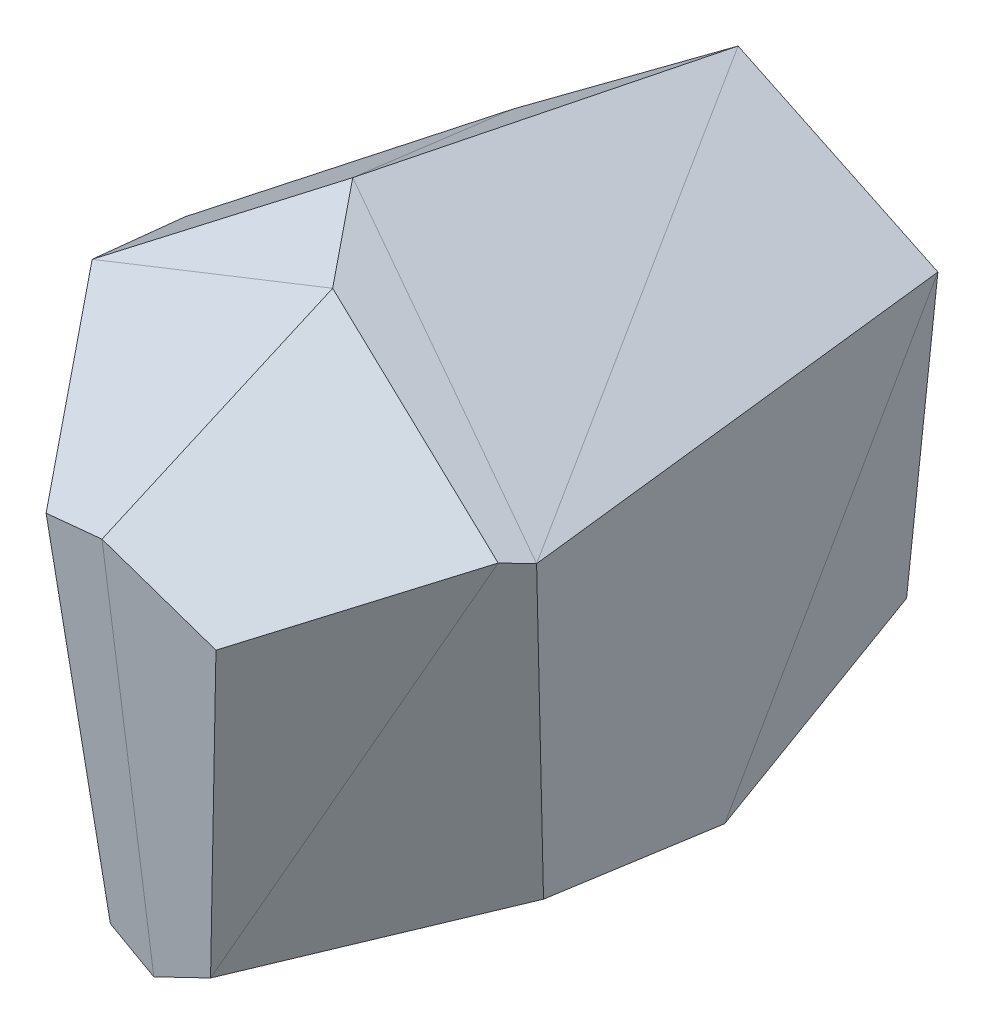
ISO-10303-21;
HEADER;
FILE_DESCRIPTION(('STEP AP214'),'2;1');
FILE_NAME('part.step','',(''),(''),'','','');
FILE_SCHEMA(('AUTOMOTIVE_DESIGN { 1 0 10303 214 1 1 1 1 }'));
ENDSEC;
DATA;
#1=APPLICATION_CONTEXT('core data for automotive mechanical design processes');
#2=APPLICATION_PROTOCOL_DEFINITION('international standard','automotive_design',2000,#1);
#3=PRODUCT_CONTEXT('',#1,'mechanical');
#4=PRODUCT('Part','Part','',(#3));
#5=PRODUCT_RELATED_PRODUCT_CATEGORY('part','',(#4));
#6=PRODUCT_DEFINITION_FORMATION('','',#4);
#7=PRODUCT_DEFINITION_CONTEXT('part definition',#1,'design');
#8=PRODUCT_DEFINITION('design','',#6,#7);
#9=PRODUCT_DEFINITION_SHAPE('','',#8);
#10=(LENGTH_UNIT() NAMED_UNIT(*) SI_UNIT(.MILLI.,.METRE.));
#11=(NAMED_UNIT(*) PLANE_ANGLE_UNIT() SI_UNIT($,.RADIAN.));
#12=(NAMED_UNIT(*) SI_UNIT($,.STERADIAN.) SOLID_ANGLE_UNIT());
#13=UNCERTAINTY_MEASURE_WITH_UNIT(LENGTH_MEASURE(1.E-05),#10,'distance_accuracy_value','');
#14=(GEOMETRIC_REPRESENTATION_CONTEXT(3) GLOBAL_UNCERTAINTY_ASSIGNED_CONTEXT((#13)) GLOBAL_UNIT_ASSIGNED_CONTEXT((#10,
#11,#12)) REPRESENTATION_CONTEXT('',''));
#15=CARTESIAN_POINT('',(0.,0.,0.));
#16=DIRECTION('',(0.,0.,1.));
#17=DIRECTION('',(1.,0.,0.));
#18=AXIS2_PLACEMENT_3D('',#15,#16,#17);
#19=CARTESIAN_POINT('',(-0.213634701442467,16.5817104423319,0.));
#20=DIRECTION('',(-0.432224087228075,-0.901090652237481,0.0348994967025046));
#21=DIRECTION('',(0.901639906907274,-0.432487546956259,0.));
#22=AXIS2_PLACEMENT_3D('',#19,#20,#21);
#23=PLANE('',#22);
#24=DIRECTION('',(-0.901639906907274,0.432487546956259,0.));
#25=VECTOR('',#24,1.);
#26=CARTESIAN_POINT('',(13.3109639021667,10.094397237988,0.));
#27=LINE('',#26,#25);
#28=CARTESIAN_POINT('',(13.3109639021667,10.094397237988,0.));
#29=VERTEX_POINT('',#28);
#30=CARTESIAN_POINT('',(-0.213634701442467,16.5817104423319,0.));
#31=VERTEX_POINT('',#30);
#32=EDGE_CURVE('E3167',#29,#31,#27,.T.);
#33=ORIENTED_EDGE('',*,*,#32,.T.);
#34=DIRECTION('',(-0.473036413338795,0.193611366423096,-0.859506364401888));
#35=VECTOR('',#34,1.);
#36=CARTESIAN_POINT('',(8.13335031301446,13.1653324879255,15.1664576789242));
#37=LINE('',#36,#35);
#38=CARTESIAN_POINT('',(16.4803353274714,9.74895453351913,30.3329153578483));
#39=VERTEX_POINT('',#38);
#40=EDGE_CURVE('E3169',#39,#31,#37,.T.);
#41=ORIENTED_EDGE('',*,*,#40,.F.);
#42=DIRECTION('',(0.103913817223106,-0.0113259903104543,0.994521815011421));
#43=VECTOR('',#42,1.);
#44=CARTESIAN_POINT('',(14.895649614819,9.92167588575355,15.1664576789242));
#45=LINE('',#44,#43);
#46=EDGE_CURVE('E3163',#29,#39,#45,.T.);
#47=ORIENTED_EDGE('',*,*,#46,.F.);
#48=EDGE_LOOP('',(#33,#41,#47));
#49=FACE_BOUND('',#48,.T.);
#50=ADVANCED_FACE('F3082',(#49),#23,.F.);
#51=CARTESIAN_POINT('',(13.3109639021667,10.094397237988,0.));
#52=DIRECTION('',(-0.989073800366903,0.103955845408877,0.104528463267657));
#53=DIRECTION('',(-0.0477677402216508,-0.896784421095503,0.439881739873936));
#54=AXIS2_PLACEMENT_3D('',#51,#52,#53);
#55=PLANE('',#54);
#56=DIRECTION('',(0.0477677402216509,0.896784421095502,-0.439881739873936));
#57=VECTOR('',#56,1.);
#58=CARTESIAN_POINT('',(12.6041939772684,-3.17439578019947,6.50847586283599));
#59=LINE('',#58,#57);
#60=CARTESIAN_POINT('',(11.8974240523701,-16.4431887983869,13.016951725672));
#61=VERTEX_POINT('',#60);
#62=EDGE_CURVE('E3172',#61,#29,#59,.T.);
#63=ORIENTED_EDGE('',*,*,#62,.T.);
#64=ORIENTED_EDGE('',*,*,#46,.T.);
#65=DIRECTION('',(0.117967495608886,0.983342151006367,0.138281900601414));
#66=VECTOR('',#65,1.);
#67=CARTESIAN_POINT('',(15.1237091279692,-1.55948020305408,28.7426735009321));
#68=LINE('',#67,#66);
#69=CARTESIAN_POINT('',(13.767082928467,-12.8679149396273,27.1524316440158));
#70=VERTEX_POINT('',#69);
#71=EDGE_CURVE('E3182',#70,#39,#68,.T.);
#72=ORIENTED_EDGE('',*,*,#71,.F.);
#73=DIRECTION('',(0.127187678646051,0.243215908759157,0.961597273356724));
#74=VECTOR('',#73,1.);
#75=CARTESIAN_POINT('',(12.8322534904185,-14.6555518690071,20.0846916848439));
#76=LINE('',#75,#74);
#77=EDGE_CURVE('E3177',#61,#70,#76,.T.);
#78=ORIENTED_EDGE('',*,*,#77,.F.);
#79=EDGE_LOOP('',(#63,#64,#72,#78));
#80=FACE_BOUND('',#79,.T.);
#81=ADVANCED_FACE('F3175',(#80),#55,.F.);
#82=CARTESIAN_POINT('',(11.1890360978333,-10.094397237988,0.));
#83=DIRECTION('',(0.989073800366903,-0.103955845408877,-0.104528463267657));
#84=DIRECTION('',(0.10452846326765,0.994521895368274,0.));
#85=AXIS2_PLACEMENT_3D('',#82,#83,#84);
#86=PLANE('',#85);
#87=DIRECTION('',(0.10452846326765,0.994521895368274,0.));
#88=VECTOR('',#87,1.);
#89=CARTESIAN_POINT('',(11.1890360978333,-10.094397237988,0.));
#90=LINE('',#89,#88);
#91=CARTESIAN_POINT('',(11.1890360978333,-10.094397237988,0.));
#92=VERTEX_POINT('',#91);
#93=EDGE_CURVE('E3185',#92,#29,#90,.T.);
#94=ORIENTED_EDGE('',*,*,#93,.T.);
#95=ORIENTED_EDGE('',*,*,#62,.F.);
#96=DIRECTION('',(0.0488543416921865,-0.437847693820615,0.897720808667033));
#97=VECTOR('',#96,1.);
#98=CARTESIAN_POINT('',(11.5432300751017,-13.2687930181874,6.50847586283599));
#99=LINE('',#98,#97);
#100=EDGE_CURVE('E3187',#92,#61,#99,.T.);
#101=ORIENTED_EDGE('',*,*,#100,.F.);
#102=EDGE_LOOP('',(#94,#95,#101));
#103=FACE_BOUND('',#102,.T.);
#104=ADVANCED_FACE('F3186',(#103),#86,.T.);
#105=CARTESIAN_POINT('',(13.767082928467,-12.8679149396273,27.1524316440158));
#106=DIRECTION('',(-0.864501868451229,0.170216240328803,-0.472930175578447));
#107=DIRECTION('',(-0.491686209419427,-0.0911190336224293,0.865991912882834));
#108=AXIS2_PLACEMENT_3D('',#105,#106,#107);
#109=PLANE('',#108);
#110=DIRECTION('',(0.491686209419428,0.091119033622429,-0.865991912882834));
#111=VECTOR('',#110,1.);
#112=CARTESIAN_POINT('',(9.68608739028576,-13.6242029186935,34.3401645209433));
#113=LINE('',#112,#111);
#114=CARTESIAN_POINT('',(5.60509185210451,-14.3804908977596,41.5278973978709));
#115=VERTEX_POINT('',#114);
#116=EDGE_CURVE('E3306',#115,#70,#113,.T.);
#117=ORIENTED_EDGE('',*,*,#116,.T.);
#118=ORIENTED_EDGE('',*,*,#71,.T.);
#119=DIRECTION('',(0.429218309342306,-0.239609962743223,-0.870837934795863));
#120=VECTOR('',#119,1.);
#121=CARTESIAN_POINT('',(16.0511170181291,9.98856449626235,31.2037532926442));
#122=LINE('',#121,#120);
#123=CARTESIAN_POINT('',(15.6218987087868,10.2281744590056,32.0745912274401));
#124=VERTEX_POINT('',#123);
#125=EDGE_CURVE('E3249',#124,#39,#122,.T.);
#126=ORIENTED_EDGE('',*,*,#125,.F.);
#127=DIRECTION('',(-0.355195235882614,-0.872621467221505,0.335213542910309));
#128=VECTOR('',#127,1.);
#129=CARTESIAN_POINT('',(10.6134952804456,-2.07615821937703,36.8012443126555));
#130=LINE('',#129,#128);
#131=EDGE_CURVE('E3208',#124,#115,#130,.T.);
#132=ORIENTED_EDGE('',*,*,#131,.T.);
#133=EDGE_LOOP('',(#117,#118,#126,#132));
#134=FACE_BOUND('',#133,.T.);
#135=ADVANCED_FACE('F3352',(#134),#109,.F.);
#136=CARTESIAN_POINT('',(-3.20887226160522,18.9127171818239,23.0901485386871));
#137=DIRECTION('',(-0.432224087228075,-0.901090652237481,0.0348994967025047));
#138=DIRECTION('',(0.12800160513516,-0.099615672627865,-0.986758484559277));
#139=AXIS2_PLACEMENT_3D('',#136,#137,#138);
#140=PLANE('',#139);
#141=DIRECTION('',(-0.12800160513516,0.0996156726278648,0.986758484559277));
#142=VECTOR('',#141,1.);
#143=CARTESIAN_POINT('',(-1.71125348152384,17.7472138120779,11.5450742693435));
#144=LINE('',#143,#142);
#145=CARTESIAN_POINT('',(-3.20887226160522,18.9127171818239,23.0901485386871));
#146=VERTEX_POINT('',#145);
#147=EDGE_CURVE('E3225',#31,#146,#144,.T.);
#148=ORIENTED_EDGE('',*,*,#147,.T.);
#149=DIRECTION('',(-0.860047334854681,0.400283739569481,-0.31637242238481));
#150=VECTOR('',#149,1.);
#151=CARTESIAN_POINT('',(6.63573153293308,14.3308358576715,26.7115319482677));
#152=LINE('',#151,#150);
#153=EDGE_CURVE('E3192',#39,#146,#152,.T.);
#154=ORIENTED_EDGE('',*,*,#153,.F.);
#155=ORIENTED_EDGE('',*,*,#40,.T.);
#156=EDGE_LOOP('',(#148,#154,#155));
#157=FACE_BOUND('',#156,.T.);
#158=ADVANCED_FACE('F3830',(#157),#140,.F.);
#159=CARTESIAN_POINT('',(0.,0.,0.));
#160=DIRECTION('',(0.,0.,-1.));
#161=DIRECTION('',(-1.,0.,0.));
#162=AXIS2_PLACEMENT_3D('',#159,#160,#161);
#163=PLANE('',#162);
#164=DIRECTION('',(1.,0.,0.));
#165=VECTOR('',#164,1.);
#166=CARTESIAN_POINT('',(-1.06096390216665,-10.094397237988,0.));
#167=LINE('',#166,#165);
#168=CARTESIAN_POINT('',(-13.3109639021667,-10.094397237988,0.));
#169=VERTEX_POINT('',#168);
#170=EDGE_CURVE('E3226',#169,#92,#167,.T.);
#171=ORIENTED_EDGE('',*,*,#170,.F.);
#172=DIRECTION('',(-0.139173100960063,0.990268068741571,0.));
#173=VECTOR('',#172,1.);
#174=CARTESIAN_POINT('',(-14.3895554346071,-2.41981970524081,0.));
#175=LINE('',#174,#173);
#176=CARTESIAN_POINT('',(-15.4681469670476,5.25475782750636,0.));
#177=VERTEX_POINT('',#176);
#178=EDGE_CURVE('E3222',#169,#177,#175,.T.);
#179=ORIENTED_EDGE('',*,*,#178,.T.);
#180=DIRECTION('',(0.802869066610797,0.596155400780289,0.));
#181=VECTOR('',#180,1.);
#182=CARTESIAN_POINT('',(-7.84089083424504,10.9182341349191,0.));
#183=LINE('',#182,#181);
#184=EDGE_CURVE('E3197',#177,#31,#183,.T.);
#185=ORIENTED_EDGE('',*,*,#184,.T.);
#186=ORIENTED_EDGE('',*,*,#32,.F.);
#187=ORIENTED_EDGE('',*,*,#93,.F.);
#188=EDGE_LOOP('',(#171,#179,#185,#186,#187));
#189=FACE_BOUND('',#188,.T.);
#190=ADVANCED_FACE('F3195',(#189),#163,.T.);
#191=CARTESIAN_POINT('',(15.6218987087868,10.2281744590056,32.0745912274401));
#192=DIRECTION('',(0.432224087228076,0.90109065223748,-0.0348994967025096));
#193=DIRECTION('',(0.429218309342308,-0.239609962743219,-0.870837934795863));
#194=AXIS2_PLACEMENT_3D('',#191,#192,#193);
#195=PLANE('',#194);
#196=ORIENTED_EDGE('',*,*,#125,.T.);
#197=ORIENTED_EDGE('',*,*,#153,.T.);
#198=DIRECTION('',(-0.580840253199202,0.248589271252592,-0.775130940216936));
#199=VECTOR('',#198,1.);
#200=CARTESIAN_POINT('',(-1.17593137540801,18.0426547324398,25.8031068294463));
#201=LINE('',#200,#199);
#202=CARTESIAN_POINT('',(0.857009510789199,17.1725922830557,28.5160651202056));
#203=VERTEX_POINT('',#202);
#204=EDGE_CURVE('E3231',#203,#146,#201,.T.);
#205=ORIENTED_EDGE('',*,*,#204,.F.);
#206=DIRECTION('',(0.884125101676501,-0.415833402637735,0.21308539564278));
#207=VECTOR('',#206,1.);
#208=CARTESIAN_POINT('',(8.23945410978799,13.7003833710307,30.2953281738228));
#209=LINE('',#208,#207);
#210=EDGE_CURVE('E3349',#203,#124,#209,.T.);
#211=ORIENTED_EDGE('',*,*,#210,.T.);
#212=EDGE_LOOP('',(#196,#197,#205,#211));
#213=FACE_BOUND('',#212,.T.);
#214=ADVANCED_FACE('F3346',(#213),#195,.T.);
#215=CARTESIAN_POINT('',(1.97169476707473,-20.1234156987358,20.5625350773406));
#216=DIRECTION('',(-0.449393337278926,0.878387524436952,-0.162729792364002));
#217=DIRECTION('',(0.164860179230892,0.260576972414976,0.951273232436929));
#218=AXIS2_PLACEMENT_3D('',#215,#216,#217);
#219=PLANE('',#218);
#220=DIRECTION('',(-0.164860179230891,-0.260576972414976,-0.951273232436929));
#221=VECTOR('',#220,1.);
#222=CARTESIAN_POINT('',(3.78839330958962,-17.2519532982477,31.0452162376058));
#223=LINE('',#222,#221);
#224=CARTESIAN_POINT('',(1.97169476707473,-20.1234156987358,20.5625350773406));
#225=VERTEX_POINT('',#224);
#226=EDGE_CURVE('E3255',#115,#225,#223,.T.);
#227=ORIENTED_EDGE('',*,*,#226,.T.);
#228=DIRECTION('',(-0.76351763733041,-0.283094376949913,0.580429488589897));
#229=VECTOR('',#228,1.);
#230=CARTESIAN_POINT('',(6.93455940972239,-18.2833022485613,16.7897434015063));
#231=LINE('',#230,#229);
#232=EDGE_CURVE('E3288',#61,#225,#231,.T.);
#233=ORIENTED_EDGE('',*,*,#232,.F.);
#234=ORIENTED_EDGE('',*,*,#77,.T.);
#235=ORIENTED_EDGE('',*,*,#116,.F.);
#236=EDGE_LOOP('',(#227,#233,#234,#235));
#237=FACE_BOUND('',#236,.T.);
#238=ADVANCED_FACE('F3356',(#237),#219,.F.);
#239=CARTESIAN_POINT('',(11.1890360978334,-10.094397237988,0.));
#240=DIRECTION('',(0.,0.898794046299165,0.438371146789082));
#241=DIRECTION('',(-0.983994627583345,-0.0781169178062516,0.16016341667049));
#242=AXIS2_PLACEMENT_3D('',#239,#240,#241);
#243=PLANE('',#242);
#244=DIRECTION('',(0.983994627583345,0.0781169178062516,-0.16016341667049));
#245=VECTOR('',#244,1.);
#246=CARTESIAN_POINT('',(-1.87100302877826,-11.1312016822415,2.12576413501935));
#247=LINE('',#246,#245);
#248=CARTESIAN_POINT('',(-14.9310421553899,-12.1680061264949,4.2515282700387));
#249=VERTEX_POINT('',#248);
#250=EDGE_CURVE('E3273',#249,#92,#247,.T.);
#251=ORIENTED_EDGE('',*,*,#250,.T.);
#252=ORIENTED_EDGE('',*,*,#100,.T.);
#253=ORIENTED_EDGE('',*,*,#232,.T.);
#254=DIRECTION('',(0.681561972680024,-0.32078264404197,0.657701887391208));
#255=VECTOR('',#254,1.);
#256=CARTESIAN_POINT('',(-6.47967369415757,-16.1457109126153,12.4070316736897));
#257=LINE('',#256,#255);
#258=EDGE_CURVE('E3291',#249,#225,#257,.T.);
#259=ORIENTED_EDGE('',*,*,#258,.F.);
#260=EDGE_LOOP('',(#251,#252,#253,#259));
#261=FACE_BOUND('',#260,.T.);
#262=ADVANCED_FACE('F3359',(#261),#243,.F.);
#263=CARTESIAN_POINT('',(15.6218987087868,10.2281744590056,32.0745912274401));
#264=DIRECTION('',(-0.86450186845123,0.170216240328803,-0.472930175578446));
#265=DIRECTION('',(-0.355195235882613,-0.872621467221506,0.335213542910309));
#266=AXIS2_PLACEMENT_3D('',#263,#264,#265);
#267=PLANE('',#266);
#268=ORIENTED_EDGE('',*,*,#131,.F.);
#269=DIRECTION('',(0.499528708255858,0.186603774485215,-0.845961051689795));
#270=VECTOR('',#269,1.);
#271=CARTESIAN_POINT('',(12.0752448801702,8.90328766016055,38.0809146944376));
#272=LINE('',#271,#270);
#273=CARTESIAN_POINT('',(8.52859105155357,7.57840086131553,44.0872381614351));
#274=VERTEX_POINT('',#273);
#275=EDGE_CURVE('E3283',#274,#124,#272,.T.);
#276=ORIENTED_EDGE('',*,*,#275,.F.);
#277=DIRECTION('',(-0.131098618809375,-0.98470366632624,-0.114768644106022));
#278=VECTOR('',#277,1.);
#279=CARTESIAN_POINT('',(7.06684145182904,-3.40104501822205,42.807567779653));
#280=LINE('',#279,#278);
#281=EDGE_CURVE('E3426',#274,#115,#280,.T.);
#282=ORIENTED_EDGE('',*,*,#281,.T.);
#283=EDGE_LOOP('',(#268,#276,#282));
#284=FACE_BOUND('',#283,.T.);
#285=ADVANCED_FACE('F3657',(#284),#267,.F.);
#286=CARTESIAN_POINT('',(0.907767731711992,10.3215097196951,44.1789208688472));
#287=DIRECTION('',(0.317423333243214,0.869183399924076,0.379160447316424));
#288=DIRECTION('',(0.940842385165627,-0.338655414614758,-0.0113188527669255));
#289=AXIS2_PLACEMENT_3D('',#286,#287,#288);
#290=PLANE('',#289);
#291=DIRECTION('',(-0.940842385165628,0.338655414614756,0.0113188527669264));
#292=VECTOR('',#291,1.);
#293=CARTESIAN_POINT('',(4.71817939163278,8.94995529050529,44.1330795151412));
#294=LINE('',#293,#292);
#295=CARTESIAN_POINT('',(0.907767731711992,10.3215097196951,44.1789208688472));
#296=VERTEX_POINT('',#295);
#297=EDGE_CURVE('E3294',#274,#296,#294,.T.);
#298=ORIENTED_EDGE('',*,*,#297,.F.);
#299=ORIENTED_EDGE('',*,*,#275,.T.);
#300=ORIENTED_EDGE('',*,*,#210,.F.);
#301=DIRECTION('',(-0.00296905345881379,0.40074750476988,-0.916183727285239));
#302=VECTOR('',#301,1.);
#303=CARTESIAN_POINT('',(0.882388621250595,13.7470510013754,36.3474929945264));
#304=LINE('',#303,#302);
#305=EDGE_CURVE('E3268',#296,#203,#304,.T.);
#306=ORIENTED_EDGE('',*,*,#305,.F.);
#307=EDGE_LOOP('',(#298,#299,#300,#306));
#308=FACE_BOUND('',#307,.T.);
#309=ADVANCED_FACE('F3654',(#308),#290,.T.);
#310=CARTESIAN_POINT('',(-13.3109639021667,-10.094397237988,0.));
#311=DIRECTION('',(0.,-0.898794046299165,-0.438371146789082));
#312=DIRECTION('',(1.,0.,0.));
#313=AXIS2_PLACEMENT_3D('',#310,#311,#312);
#314=PLANE('',#313);
#315=ORIENTED_EDGE('',*,*,#170,.T.);
#316=ORIENTED_EDGE('',*,*,#250,.F.);
#317=DIRECTION('',(0.324015650644643,0.414721777701388,-0.850305654007739));
#318=VECTOR('',#317,1.);
#319=CARTESIAN_POINT('',(-14.1210030287783,-11.1312016822414,2.12576413501935));
#320=LINE('',#319,#318);
#321=EDGE_CURVE('E3263',#249,#169,#320,.T.);
#322=ORIENTED_EDGE('',*,*,#321,.T.);
#323=EDGE_LOOP('',(#315,#316,#322));
#324=FACE_BOUND('',#323,.T.);
#325=ADVANCED_FACE('F3770',(#324),#314,.T.);
#326=CARTESIAN_POINT('',(-13.3109639021667,-10.094397237988,0.));
#327=DIRECTION('',(-0.904654896047371,-0.1271409542081,-0.406736643075804));
#328=DIRECTION('',(-0.396459101793276,0.601103697505697,0.693898065604919));
#329=AXIS2_PLACEMENT_3D('',#326,#327,#328);
#330=PLANE('',#329);
#331=DIRECTION('',(0.396459101793276,-0.601103697505697,-0.693898065604919));
#332=VECTOR('',#331,1.);
#333=CARTESIAN_POINT('',(-17.740409280741,-3.37855698380491,7.75258675104907));
#334=LINE('',#333,#332);
#335=CARTESIAN_POINT('',(-22.1698546593153,3.33728327037816,15.5051735020981));
#336=VERTEX_POINT('',#335);
#337=EDGE_CURVE('E3219',#336,#169,#334,.T.);
#338=ORIENTED_EDGE('',*,*,#337,.F.);
#339=DIRECTION('',(-0.394218099545157,-0.112792621007541,0.912069029535185));
#340=VECTOR('',#339,1.);
#341=CARTESIAN_POINT('',(-18.8190008131815,4.29602054894227,7.75258675104907));
#342=LINE('',#341,#340);
#343=EDGE_CURVE('E3214',#177,#336,#342,.T.);
#344=ORIENTED_EDGE('',*,*,#343,.F.);
#345=ORIENTED_EDGE('',*,*,#178,.F.);
#346=EDGE_LOOP('',(#338,#344,#345));
#347=FACE_BOUND('',#346,.T.);
#348=ADVANCED_FACE('F3760',(#347),#330,.T.);
#349=CARTESIAN_POINT('',(-15.4681469670476,5.25475782750636,0.));
#350=DIRECTION('',(-0.588815738533512,0.792984416115985,-0.156434465040235));
#351=DIRECTION('',(0.415632009467005,0.463052279033567,0.782836266142696));
#352=AXIS2_PLACEMENT_3D('',#349,#350,#351);
#353=PLANE('',#352);
#354=DIRECTION('',(-0.415632009467005,-0.463052279033568,-0.782836266142696));
#355=VECTOR('',#354,1.);
#356=CARTESIAN_POINT('',(-9.33850961432641,12.0837375046651,11.5450742693435));
#357=LINE('',#356,#355);
#358=EDGE_CURVE('E3218',#146,#177,#357,.T.);
#359=ORIENTED_EDGE('',*,*,#358,.F.);
#360=ORIENTED_EDGE('',*,*,#147,.F.);
#361=ORIENTED_EDGE('',*,*,#184,.F.);
#362=EDGE_LOOP('',(#359,#360,#361));
#363=FACE_BOUND('',#362,.T.);
#364=ADVANCED_FACE('F3750',(#363),#353,.T.);
#365=CARTESIAN_POINT('',(0.857009510789199,17.1725922830557,28.5160651202056));
#366=DIRECTION('',(0.141832227832622,-0.90675691703383,-0.397083760130453));
#367=DIRECTION('',(-0.945458123816266,-0.242922362669883,0.217019957203726));
#368=AXIS2_PLACEMENT_3D('',#365,#366,#367);
#369=PLANE('',#368);
#370=DIRECTION('',(0.945458123816267,0.242922362669884,-0.217019957203725));
#371=VECTOR('',#370,1.);
#372=CARTESIAN_POINT('',(-5.76277459005345,15.4717304959146,30.0355668581186));
#373=LINE('',#372,#371);
#374=CARTESIAN_POINT('',(-12.3825586908961,13.7708687087735,31.5550685960316));
#375=VERTEX_POINT('',#374);
#376=EDGE_CURVE('E3422',#375,#203,#373,.T.);
#377=ORIENTED_EDGE('',*,*,#376,.T.);
#378=ORIENTED_EDGE('',*,*,#204,.T.);
#379=DIRECTION('',(-0.67953232809562,-0.380877664670399,0.627031115358855));
#380=VECTOR('',#379,1.);
#381=CARTESIAN_POINT('',(-7.79571547625065,16.3417929452987,27.3226085673593));
#382=LINE('',#381,#380);
#383=EDGE_CURVE('E3237',#146,#375,#382,.T.);
#384=ORIENTED_EDGE('',*,*,#383,.T.);
#385=EDGE_LOOP('',(#377,#378,#384));
#386=FACE_BOUND('',#385,.T.);
#387=ADVANCED_FACE('F3741',(#386),#369,.F.);
#388=CARTESIAN_POINT('',(5.60509185210451,-14.3804908977596,41.5278973978709));
#389=DIRECTION('',(-0.449393337278928,0.878387524436952,-0.162729792364002));
#390=DIRECTION('',(-0.164860179230892,-0.260576972414976,-0.951273232436929));
#391=AXIS2_PLACEMENT_3D('',#388,#389,#390);
#392=PLANE('',#391);
#393=ORIENTED_EDGE('',*,*,#226,.F.);
#394=DIRECTION('',(-0.881659182496142,-0.465453400050153,-0.077654480244135));
#395=VECTOR('',#394,1.);
#396=CARTESIAN_POINT('',(3.49936018472321,-15.4921675905617,41.3424294739718));
#397=LINE('',#396,#395);
#398=CARTESIAN_POINT('',(1.39362851734191,-16.6038442833638,41.1569615500727));
#399=VERTEX_POINT('',#398);
#400=EDGE_CURVE('E3365',#115,#399,#397,.T.);
#401=ORIENTED_EDGE('',*,*,#400,.T.);
#402=DIRECTION('',(-0.0276573443507364,0.168392461325914,0.985331949280072));
#403=VECTOR('',#402,1.);
#404=CARTESIAN_POINT('',(1.68266164220832,-18.3636299910498,30.8597483137067));
#405=LINE('',#404,#403);
#406=EDGE_CURVE('E3260',#225,#399,#405,.T.);
#407=ORIENTED_EDGE('',*,*,#406,.F.);
#408=EDGE_LOOP('',(#393,#401,#407));
#409=FACE_BOUND('',#408,.T.);
#410=ADVANCED_FACE('F3362',(#409),#392,.F.);
#411=CARTESIAN_POINT('',(-20.72319051607,-6.86057278264977,15.475260655859));
#412=DIRECTION('',(0.521782412326185,0.843198813198828,-0.129456075976198));
#413=DIRECTION('',(0.847649906448324,-0.495364810916608,0.190008789806421));
#414=AXIS2_PLACEMENT_3D('',#411,#412,#413);
#415=PLANE('',#414);
#416=DIRECTION('',(-0.847649906448324,0.495364810916608,-0.190008789806422));
#417=VECTOR('',#416,1.);
#418=CARTESIAN_POINT('',(-9.37574787449766,-13.4919942406928,18.0188978665998));
#419=LINE('',#418,#417);
#420=CARTESIAN_POINT('',(-20.72319051607,-6.86057278264977,15.475260655859));
#421=VERTEX_POINT('',#420);
#422=EDGE_CURVE('E3101',#225,#421,#419,.T.);
#423=ORIENTED_EDGE('',*,*,#422,.T.);
#424=DIRECTION('',(0.422784551874466,-0.387403893711325,-0.819250539110968));
#425=VECTOR('',#424,1.);
#426=CARTESIAN_POINT('',(-17.82711633573,-9.51428945457234,9.86339446294883));
#427=LINE('',#426,#425);
#428=EDGE_CURVE('E3267',#421,#249,#427,.T.);
#429=ORIENTED_EDGE('',*,*,#428,.T.);
#430=ORIENTED_EDGE('',*,*,#258,.T.);
#431=EDGE_LOOP('',(#423,#429,#430));
#432=FACE_BOUND('',#431,.T.);
#433=ADVANCED_FACE('F3368',(#432),#415,.F.);
#434=CARTESIAN_POINT('',(8.52859105155358,7.57840086131553,44.0872381614351));
#435=DIRECTION('',(0.0283625009500825,0.111994972845945,-0.993303928612533));
#436=DIRECTION('',(-0.131098618809375,-0.98470366632624,-0.114768644106022));
#437=AXIS2_PLACEMENT_3D('',#434,#435,#436);
#438=PLANE('',#437);
#439=ORIENTED_EDGE('',*,*,#281,.F.);
#440=ORIENTED_EDGE('',*,*,#297,.T.);
#441=DIRECTION('',(-0.0179292602917713,0.993600831034429,0.111516501886864));
#442=VECTOR('',#441,1.);
#443=CARTESIAN_POINT('',(1.15069812452695,-3.14116728183437,42.66794120946));
#444=LINE('',#443,#442);
#445=EDGE_CURVE('E3410',#399,#296,#444,.T.);
#446=ORIENTED_EDGE('',*,*,#445,.F.);
#447=ORIENTED_EDGE('',*,*,#400,.F.);
#448=EDGE_LOOP('',(#439,#440,#446,#447));
#449=FACE_BOUND('',#448,.T.);
#450=ADVANCED_FACE('F3659',(#449),#438,.F.);
#451=CARTESIAN_POINT('',(-3.05137636973384,9.77854664288249,44.0046535993877));
#452=DIRECTION('',(-0.141832227832622,0.906756917033831,0.397083760130451));
#453=DIRECTION('',(0.989786025361458,0.135740769203145,0.0435668173648894));
#454=AXIS2_PLACEMENT_3D('',#451,#452,#453);
#455=PLANE('',#454);
#456=DIRECTION('',(-0.989786025361458,-0.135740769203148,-0.0435668173648876));
#457=VECTOR('',#456,1.);
#458=CARTESIAN_POINT('',(-1.07180431901092,10.0500281812888,44.0917872341175));
#459=LINE('',#458,#457);
#460=CARTESIAN_POINT('',(-3.05137636973384,9.77854664288249,44.0046535993877));
#461=VERTEX_POINT('',#460);
#462=EDGE_CURVE('E3414',#296,#461,#459,.T.);
#463=ORIENTED_EDGE('',*,*,#462,.F.);
#464=ORIENTED_EDGE('',*,*,#305,.T.);
#465=ORIENTED_EDGE('',*,*,#376,.F.);
#466=DIRECTION('',(0.580932048501189,-0.248550264713474,0.775074655072061));
#467=VECTOR('',#466,1.);
#468=CARTESIAN_POINT('',(-7.71696753031497,11.774707675828,37.7798610977097));
#469=LINE('',#468,#467);
#470=EDGE_CURVE('E3392',#375,#461,#469,.T.);
#471=ORIENTED_EDGE('',*,*,#470,.T.);
#472=EDGE_LOOP('',(#463,#464,#465,#471));
#473=FACE_BOUND('',#472,.T.);
#474=ADVANCED_FACE('F3707',(#473),#455,.T.);
#475=CARTESIAN_POINT('',(-20.72319051607,-6.86057278264977,15.475260655859));
#476=DIRECTION('',(-0.904654896047371,-0.127140954208099,-0.406736643075805));
#477=DIRECTION('',(-0.140452829441285,0.990083111944459,0.00290415982904705));
#478=AXIS2_PLACEMENT_3D('',#475,#476,#477);
#479=PLANE('',#478);
#480=DIRECTION('',(0.140452829441285,-0.990083111944459,-0.00290415982904469));
#481=VECTOR('',#480,1.);
#482=CARTESIAN_POINT('',(-21.4465225876927,-1.7616447561358,15.4902170789786));
#483=LINE('',#482,#481);
#484=EDGE_CURVE('E3386',#336,#421,#483,.T.);
#485=ORIENTED_EDGE('',*,*,#484,.F.);
#486=ORIENTED_EDGE('',*,*,#337,.T.);
#487=ORIENTED_EDGE('',*,*,#321,.F.);
#488=ORIENTED_EDGE('',*,*,#428,.F.);
#489=EDGE_LOOP('',(#485,#486,#487,#488));
#490=FACE_BOUND('',#489,.T.);
#491=ADVANCED_FACE('F3697',(#490),#479,.T.);
#492=CARTESIAN_POINT('',(-3.20887226160522,18.9127171818239,23.0901485386871));
#493=DIRECTION('',(0.588815738533513,-0.792984416115985,0.156434465040235));
#494=DIRECTION('',(-0.67953232809562,-0.380877664670398,0.627031115358855));
#495=AXIS2_PLACEMENT_3D('',#492,#493,#494);
#496=PLANE('',#495);
#497=ORIENTED_EDGE('',*,*,#383,.F.);
#498=ORIENTED_EDGE('',*,*,#358,.T.);
#499=ORIENTED_EDGE('',*,*,#343,.T.);
#500=DIRECTION('',(-0.455223068298567,-0.485283043646296,-0.746506748555045));
#501=VECTOR('',#500,1.);
#502=CARTESIAN_POINT('',(-17.2762066751057,8.55407598957584,23.5301210490649));
#503=LINE('',#502,#501);
#504=EDGE_CURVE('E3380',#375,#336,#503,.T.);
#505=ORIENTED_EDGE('',*,*,#504,.F.);
#506=EDGE_LOOP('',(#497,#498,#499,#505));
#507=FACE_BOUND('',#506,.T.);
#508=ADVANCED_FACE('F3668',(#507),#496,.F.);
#509=CARTESIAN_POINT('',(1.97169476707473,-20.1234156987358,20.5625350773406));
#510=DIRECTION('',(0.521782412326184,0.843198813198828,-0.129456075976198));
#511=DIRECTION('',(-0.847649906448324,0.495364810916608,-0.190008789806421));
#512=AXIS2_PLACEMENT_3D('',#509,#510,#511);
#513=PLANE('',#512);
#514=ORIENTED_EDGE('',*,*,#422,.F.);
#515=ORIENTED_EDGE('',*,*,#406,.T.);
#516=DIRECTION('',(-0.84736632394385,0.529818000735556,0.035541512945642));
#517=VECTOR('',#516,1.);
#518=CARTESIAN_POINT('',(-0.0171779568425524,-15.7217338613939,41.216135717312));
#519=LINE('',#518,#517);
#520=CARTESIAN_POINT('',(-1.42798443102702,-14.839623439424,41.2753098845514));
#521=VERTEX_POINT('',#520);
#522=EDGE_CURVE('E3324',#399,#521,#519,.T.);
#523=ORIENTED_EDGE('',*,*,#522,.T.);
#524=DIRECTION('',(-0.581346338039836,0.240401261323958,-0.777331119151629));
#525=VECTOR('',#524,1.);
#526=CARTESIAN_POINT('',(-11.0755874735485,-10.8500981110369,28.3752852702052));
#527=LINE('',#526,#525);
#528=EDGE_CURVE('E3373',#521,#421,#527,.T.);
#529=ORIENTED_EDGE('',*,*,#528,.T.);
#530=EDGE_LOOP('',(#514,#515,#523,#529));
#531=FACE_BOUND('',#530,.T.);
#532=ADVANCED_FACE('F3371',(#531),#513,.F.);
#533=CARTESIAN_POINT('',(1.39362851734191,-16.6038442833638,41.1569615500727));
#534=DIRECTION('',(-0.0283625009500895,-0.111994972845945,0.993303928612533));
#535=DIRECTION('',(-0.0179292602917713,0.993600831034429,0.111516501886864));
#536=AXIS2_PLACEMENT_3D('',#533,#534,#535);
#537=PLANE('',#536);
#538=ORIENTED_EDGE('',*,*,#445,.T.);
#539=ORIENTED_EDGE('',*,*,#462,.T.);
#540=DIRECTION('',(0.0654009458803921,-0.991782434567082,-0.109955985567598));
#541=VECTOR('',#540,1.);
#542=CARTESIAN_POINT('',(-2.23968040038043,-2.53053839827077,42.6399817419695));
#543=LINE('',#542,#541);
#544=EDGE_CURVE('E3092',#461,#521,#543,.T.);
#545=ORIENTED_EDGE('',*,*,#544,.T.);
#546=ORIENTED_EDGE('',*,*,#522,.F.);
#547=EDGE_LOOP('',(#538,#539,#545,#546));
#548=FACE_BOUND('',#547,.T.);
#549=ADVANCED_FACE('F3660',(#548),#537,.T.);
#550=CARTESIAN_POINT('',(-12.3825586908961,13.7708687087735,31.5550685960316));
#551=DIRECTION('',(-0.812327744082507,-0.116912465960534,0.571362504454791));
#552=DIRECTION('',(-0.455223068298567,-0.485283043646295,-0.746506748555045));
#553=AXIS2_PLACEMENT_3D('',#550,#551,#552);
#554=PLANE('',#553);
#555=ORIENTED_EDGE('',*,*,#504,.T.);
#556=ORIENTED_EDGE('',*,*,#484,.T.);
#557=DIRECTION('',(-0.47178049812641,-0.444210876481515,-0.761642868280876));
#558=VECTOR('',#557,1.);
#559=CARTESIAN_POINT('',(-11.8872834429019,1.45898693011636,29.7399571276233));
#560=LINE('',#559,#558);
#561=EDGE_CURVE('E13',#461,#421,#560,.T.);
#562=ORIENTED_EDGE('',*,*,#561,.F.);
#563=ORIENTED_EDGE('',*,*,#470,.F.);
#564=EDGE_LOOP('',(#555,#556,#562,#563));
#565=FACE_BOUND('',#564,.T.);
#566=ADVANCED_FACE('F3387',(#565),#554,.T.);
#567=CARTESIAN_POINT('',(-3.05137636973384,9.77854664288248,44.0046535993877));
#568=DIRECTION('',(-0.812327744082508,-0.116912465960533,0.571362504454791));
#569=DIRECTION('',(-0.47178049812641,-0.444210876481515,-0.761642868280876));
#570=AXIS2_PLACEMENT_3D('',#567,#568,#569);
#571=PLANE('',#570);
#572=ORIENTED_EDGE('',*,*,#561,.T.);
#573=ORIENTED_EDGE('',*,*,#528,.F.);
#574=ORIENTED_EDGE('',*,*,#544,.F.);
#575=EDGE_LOOP('',(#572,#573,#574));
#576=FACE_BOUND('',#575,.T.);
#577=ADVANCED_FACE('F3394',(#576),#571,.T.);
#578=CLOSED_SHELL('',(#50,#81,#104,#135,#158,#190,#214,#238,#262,#285,#309,#325,#348,#364,#387,
#410,#433,#450,#474,#491,#508,#532,#549,#566,#577));
#579=MANIFOLD_SOLID_BREP('B2',#578);
#580=ADVANCED_BREP_SHAPE_REPRESENTATION('',(#18,#579),#14);
#581=SHAPE_DEFINITION_REPRESENTATION(#9,#580);
ENDSEC;
END-ISO-10303-21;
